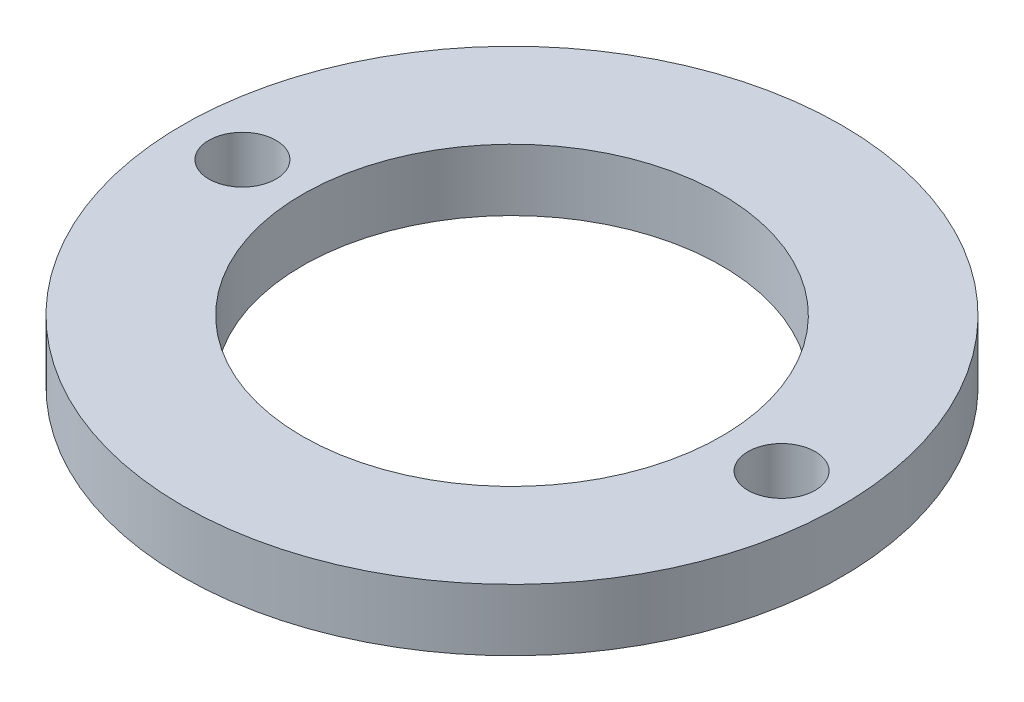
ISO-10303-21;
HEADER;
FILE_DESCRIPTION(('STEP AP214'),'2;1');
FILE_NAME('part.step','',(''),(''),'','','');
FILE_SCHEMA(('AUTOMOTIVE_DESIGN { 1 0 10303 214 1 1 1 1 }'));
ENDSEC;
DATA;
#1=APPLICATION_CONTEXT('core data for automotive mechanical design processes');
#2=APPLICATION_PROTOCOL_DEFINITION('international standard','automotive_design',2000,#1);
#3=PRODUCT_CONTEXT('',#1,'mechanical');
#4=PRODUCT('Part','Part','',(#3));
#5=PRODUCT_RELATED_PRODUCT_CATEGORY('part','',(#4));
#6=PRODUCT_DEFINITION_FORMATION('','',#4);
#7=PRODUCT_DEFINITION_CONTEXT('part definition',#1,'design');
#8=PRODUCT_DEFINITION('design','',#6,#7);
#9=PRODUCT_DEFINITION_SHAPE('','',#8);
#10=(LENGTH_UNIT() NAMED_UNIT(*) SI_UNIT(.MILLI.,.METRE.));
#11=(NAMED_UNIT(*) PLANE_ANGLE_UNIT() SI_UNIT($,.RADIAN.));
#12=(NAMED_UNIT(*) SI_UNIT($,.STERADIAN.) SOLID_ANGLE_UNIT());
#13=UNCERTAINTY_MEASURE_WITH_UNIT(LENGTH_MEASURE(1.E-05),#10,'distance_accuracy_value','');
#14=(GEOMETRIC_REPRESENTATION_CONTEXT(3) GLOBAL_UNCERTAINTY_ASSIGNED_CONTEXT((#13)) GLOBAL_UNIT_ASSIGNED_CONTEXT((#10,
#11,#12)) REPRESENTATION_CONTEXT('',''));
#15=CARTESIAN_POINT('',(0.,0.,0.));
#16=DIRECTION('',(0.,0.,1.));
#17=DIRECTION('',(1.,0.,0.));
#18=AXIS2_PLACEMENT_3D('',#15,#16,#17);
#19=CARTESIAN_POINT('',(0.,3.,0.));
#20=DIRECTION('',(0.,1.,0.));
#21=DIRECTION('',(0.,0.,1.));
#22=AXIS2_PLACEMENT_3D('',#19,#20,#21);
#23=PLANE('',#22);
#24=CARTESIAN_POINT('',(-13.0875,3.,0.));
#25=DIRECTION('',(0.,1.,0.));
#26=DIRECTION('',(0.,0.,1.));
#27=AXIS2_PLACEMENT_3D('',#24,#25,#26);
#28=CIRCLE('',#27,1.63195);
#29=CARTESIAN_POINT('',(-13.0875,3.,1.63195));
#30=VERTEX_POINT('',#29);
#31=EDGE_CURVE('E58',#30,#30,#28,.T.);
#32=ORIENTED_EDGE('',*,*,#31,.F.);
#33=EDGE_LOOP('',(#32));
#34=FACE_BOUND('',#33,.T.);
#35=CARTESIAN_POINT('',(13.0875,3.,0.));
#36=DIRECTION('',(0.,1.,0.));
#37=DIRECTION('',(0.,0.,1.));
#38=AXIS2_PLACEMENT_3D('',#35,#36,#37);
#39=CIRCLE('',#38,1.63195);
#40=CARTESIAN_POINT('',(13.0875,3.,1.63195));
#41=VERTEX_POINT('',#40);
#42=EDGE_CURVE('E52',#41,#41,#39,.T.);
#43=ORIENTED_EDGE('',*,*,#42,.F.);
#44=EDGE_LOOP('',(#43));
#45=FACE_BOUND('',#44,.T.);
#46=CARTESIAN_POINT('',(0.,3.,0.));
#47=DIRECTION('',(0.,1.,0.));
#48=DIRECTION('',(0.,0.,1.));
#49=AXIS2_PLACEMENT_3D('',#46,#47,#48);
#50=CIRCLE('',#49,16.);
#51=CARTESIAN_POINT('',(0.,3.,16.));
#52=VERTEX_POINT('',#51);
#53=EDGE_CURVE('E10',#52,#52,#50,.T.);
#54=ORIENTED_EDGE('',*,*,#53,.T.);
#55=EDGE_LOOP('',(#54));
#56=FACE_BOUND('',#55,.T.);
#57=CARTESIAN_POINT('',(0.,3.,0.));
#58=DIRECTION('',(0.,1.,0.));
#59=DIRECTION('',(0.,0.,1.));
#60=AXIS2_PLACEMENT_3D('',#57,#58,#59);
#61=CIRCLE('',#60,10.175);
#62=CARTESIAN_POINT('',(0.,3.,10.175));
#63=VERTEX_POINT('',#62);
#64=EDGE_CURVE('E42',#63,#63,#61,.T.);
#65=ORIENTED_EDGE('',*,*,#64,.F.);
#66=EDGE_LOOP('',(#65));
#67=FACE_BOUND('',#66,.T.);
#68=ADVANCED_FACE('F31',(#34,#45,#56,#67),#23,.T.);
#69=CARTESIAN_POINT('',(0.,0.,0.));
#70=DIRECTION('',(0.,1.,0.));
#71=DIRECTION('',(0.,0.,1.));
#72=AXIS2_PLACEMENT_3D('',#69,#70,#71);
#73=PLANE('',#72);
#74=CARTESIAN_POINT('',(-13.0875,0.,0.));
#75=DIRECTION('',(0.,1.,0.));
#76=DIRECTION('',(0.,0.,1.));
#77=AXIS2_PLACEMENT_3D('',#74,#75,#76);
#78=CIRCLE('',#77,1.63195);
#79=CARTESIAN_POINT('',(-13.0875,0.,1.63195));
#80=VERTEX_POINT('',#79);
#81=EDGE_CURVE('E55',#80,#80,#78,.T.);
#82=ORIENTED_EDGE('',*,*,#81,.T.);
#83=EDGE_LOOP('',(#82));
#84=FACE_BOUND('',#83,.T.);
#85=CARTESIAN_POINT('',(13.0875,0.,0.));
#86=DIRECTION('',(0.,1.,0.));
#87=DIRECTION('',(0.,0.,1.));
#88=AXIS2_PLACEMENT_3D('',#85,#86,#87);
#89=CIRCLE('',#88,1.63195);
#90=CARTESIAN_POINT('',(13.0875,0.,1.63195));
#91=VERTEX_POINT('',#90);
#92=EDGE_CURVE('E47',#91,#91,#89,.T.);
#93=ORIENTED_EDGE('',*,*,#92,.T.);
#94=EDGE_LOOP('',(#93));
#95=FACE_BOUND('',#94,.T.);
#96=CARTESIAN_POINT('',(0.,0.,0.));
#97=DIRECTION('',(0.,1.,0.));
#98=DIRECTION('',(0.,0.,1.));
#99=AXIS2_PLACEMENT_3D('',#96,#97,#98);
#100=CIRCLE('',#99,16.);
#101=CARTESIAN_POINT('',(0.,0.,16.));
#102=VERTEX_POINT('',#101);
#103=EDGE_CURVE('E35',#102,#102,#100,.T.);
#104=ORIENTED_EDGE('',*,*,#103,.F.);
#105=EDGE_LOOP('',(#104));
#106=FACE_BOUND('',#105,.T.);
#107=CARTESIAN_POINT('',(0.,0.,0.));
#108=DIRECTION('',(0.,1.,0.));
#109=DIRECTION('',(0.,0.,1.));
#110=AXIS2_PLACEMENT_3D('',#107,#108,#109);
#111=CIRCLE('',#110,10.175);
#112=CARTESIAN_POINT('',(0.,0.,10.175));
#113=VERTEX_POINT('',#112);
#114=EDGE_CURVE('E44',#113,#113,#111,.T.);
#115=ORIENTED_EDGE('',*,*,#114,.T.);
#116=EDGE_LOOP('',(#115));
#117=FACE_BOUND('',#116,.T.);
#118=ADVANCED_FACE('F66',(#84,#95,#106,#117),#73,.F.);
#119=CARTESIAN_POINT('',(0.,3.,0.));
#120=DIRECTION('',(0.,-1.,0.));
#121=DIRECTION('',(0.,0.,-1.));
#122=AXIS2_PLACEMENT_3D('',#119,#120,#121);
#123=CYLINDRICAL_SURFACE('',#122,16.);
#124=ORIENTED_EDGE('',*,*,#53,.F.);
#125=EDGE_LOOP('',(#124));
#126=FACE_BOUND('',#125,.T.);
#127=ORIENTED_EDGE('',*,*,#103,.T.);
#128=EDGE_LOOP('',(#127));
#129=FACE_BOUND('',#128,.T.);
#130=ADVANCED_FACE('F33',(#126,#129),#123,.T.);
#131=CARTESIAN_POINT('',(0.,3.,0.));
#132=DIRECTION('',(0.,-1.,0.));
#133=DIRECTION('',(0.,0.,-1.));
#134=AXIS2_PLACEMENT_3D('',#131,#132,#133);
#135=CYLINDRICAL_SURFACE('',#134,10.175);
#136=ORIENTED_EDGE('',*,*,#64,.T.);
#137=EDGE_LOOP('',(#136));
#138=FACE_BOUND('',#137,.T.);
#139=ORIENTED_EDGE('',*,*,#114,.F.);
#140=EDGE_LOOP('',(#139));
#141=FACE_BOUND('',#140,.T.);
#142=ADVANCED_FACE('F72',(#138,#141),#135,.F.);
#143=CARTESIAN_POINT('',(13.0875,3.,0.));
#144=DIRECTION('',(0.,1.,0.));
#145=DIRECTION('',(0.,0.,1.));
#146=AXIS2_PLACEMENT_3D('',#143,#144,#145);
#147=CYLINDRICAL_SURFACE('',#146,1.63195);
#148=ORIENTED_EDGE('',*,*,#92,.F.);
#149=EDGE_LOOP('',(#148));
#150=FACE_BOUND('',#149,.T.);
#151=ORIENTED_EDGE('',*,*,#42,.T.);
#152=EDGE_LOOP('',(#151));
#153=FACE_BOUND('',#152,.T.);
#154=ADVANCED_FACE('F75',(#150,#153),#147,.F.);
#155=CARTESIAN_POINT('',(-13.0875,3.,0.));
#156=DIRECTION('',(0.,1.,0.));
#157=DIRECTION('',(0.,0.,1.));
#158=AXIS2_PLACEMENT_3D('',#155,#156,#157);
#159=CYLINDRICAL_SURFACE('',#158,1.63195);
#160=ORIENTED_EDGE('',*,*,#81,.F.);
#161=EDGE_LOOP('',(#160));
#162=FACE_BOUND('',#161,.T.);
#163=ORIENTED_EDGE('',*,*,#31,.T.);
#164=EDGE_LOOP('',(#163));
#165=FACE_BOUND('',#164,.T.);
#166=ADVANCED_FACE('F62',(#162,#165),#159,.F.);
#167=CLOSED_SHELL('',(#68,#118,#130,#142,#154,#166));
#168=MANIFOLD_SOLID_BREP('B2',#167);
#169=ADVANCED_BREP_SHAPE_REPRESENTATION('',(#18,#168),#14);
#170=SHAPE_DEFINITION_REPRESENTATION(#9,#169);
ENDSEC;
END-ISO-10303-21;
